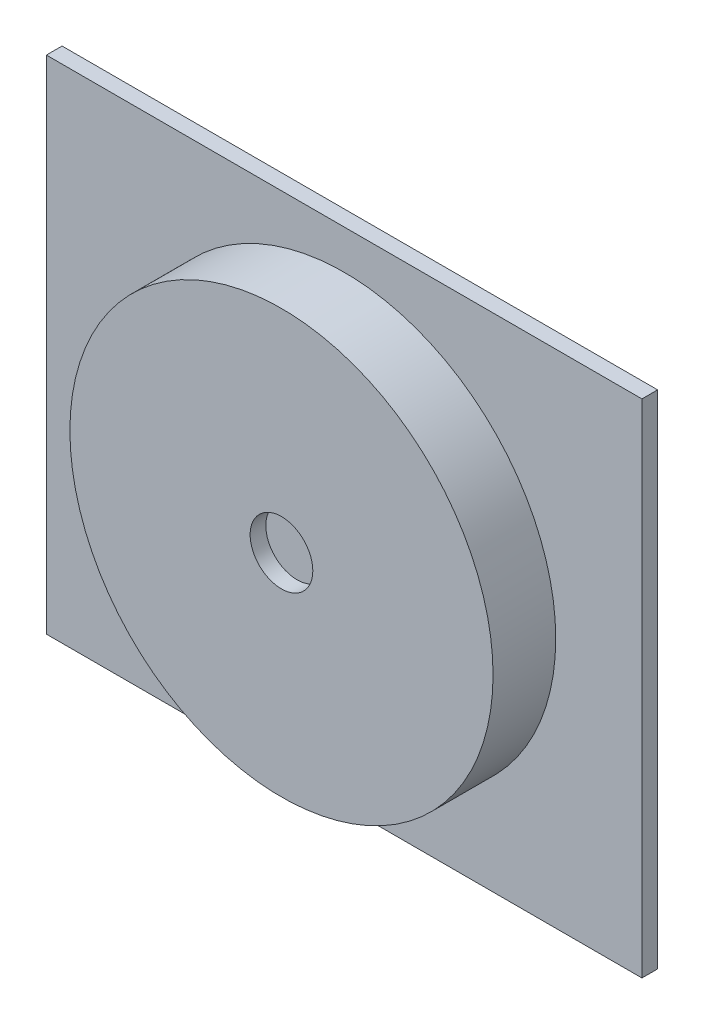
ISO-10303-21;
HEADER;
FILE_DESCRIPTION(('STEP AP214'),'2;1');
FILE_NAME('part.step','',(''),(''),'','','');
FILE_SCHEMA(('AUTOMOTIVE_DESIGN { 1 0 10303 214 1 1 1 1 }'));
ENDSEC;
DATA;
#1=APPLICATION_CONTEXT('core data for automotive mechanical design processes');
#2=APPLICATION_PROTOCOL_DEFINITION('international standard','automotive_design',2000,#1);
#3=PRODUCT_CONTEXT('',#1,'mechanical');
#4=PRODUCT('Part','Part','',(#3));
#5=PRODUCT_RELATED_PRODUCT_CATEGORY('part','',(#4));
#6=PRODUCT_DEFINITION_FORMATION('','',#4);
#7=PRODUCT_DEFINITION_CONTEXT('part definition',#1,'design');
#8=PRODUCT_DEFINITION('design','',#6,#7);
#9=PRODUCT_DEFINITION_SHAPE('','',#8);
#10=(LENGTH_UNIT() NAMED_UNIT(*) SI_UNIT(.MILLI.,.METRE.));
#11=(NAMED_UNIT(*) PLANE_ANGLE_UNIT() SI_UNIT($,.RADIAN.));
#12=(NAMED_UNIT(*) SI_UNIT($,.STERADIAN.) SOLID_ANGLE_UNIT());
#13=UNCERTAINTY_MEASURE_WITH_UNIT(LENGTH_MEASURE(1.E-05),#10,'distance_accuracy_value','');
#14=(GEOMETRIC_REPRESENTATION_CONTEXT(3) GLOBAL_UNCERTAINTY_ASSIGNED_CONTEXT((#13)) GLOBAL_UNIT_ASSIGNED_CONTEXT((#10,
#11,#12)) REPRESENTATION_CONTEXT('',''));
#15=CARTESIAN_POINT('',(0.,0.,0.));
#16=DIRECTION('',(0.,0.,1.));
#17=DIRECTION('',(1.,0.,0.));
#18=AXIS2_PLACEMENT_3D('',#15,#16,#17);
#19=CARTESIAN_POINT('',(-22.0558035714286,11.8973214285714,1.));
#20=DIRECTION('',(1.,0.,0.));
#21=DIRECTION('',(0.,0.,-1.));
#22=AXIS2_PLACEMENT_3D('',#19,#20,#21);
#23=PLANE('',#22);
#24=DIRECTION('',(0.,-1.,0.));
#25=VECTOR('',#24,1.);
#26=CARTESIAN_POINT('',(-22.0558035714286,11.8973214285714,0.));
#27=LINE('',#26,#25);
#28=CARTESIAN_POINT('',(-22.0558035714286,11.8973214285714,0.));
#29=VERTEX_POINT('',#28);
#30=CARTESIAN_POINT('',(-22.0558035714286,-20.1026785714286,0.));
#31=VERTEX_POINT('',#30);
#32=EDGE_CURVE('E98',#29,#31,#27,.T.);
#33=ORIENTED_EDGE('',*,*,#32,.T.);
#34=DIRECTION('',(0.,0.,-1.));
#35=VECTOR('',#34,1.);
#36=CARTESIAN_POINT('',(-22.0558035714286,-20.1026785714286,1.));
#37=LINE('',#36,#35);
#38=CARTESIAN_POINT('',(-22.0558035714286,-20.1026785714286,1.));
#39=VERTEX_POINT('',#38);
#40=EDGE_CURVE('E35',#39,#31,#37,.T.);
#41=ORIENTED_EDGE('',*,*,#40,.F.);
#42=DIRECTION('',(0.,-1.,0.));
#43=VECTOR('',#42,1.);
#44=CARTESIAN_POINT('',(-22.0558035714286,11.8973214285714,1.));
#45=LINE('',#44,#43);
#46=CARTESIAN_POINT('',(-22.0558035714286,11.8973214285714,1.));
#47=VERTEX_POINT('',#46);
#48=EDGE_CURVE('E85',#47,#39,#45,.T.);
#49=ORIENTED_EDGE('',*,*,#48,.F.);
#50=DIRECTION('',(0.,0.,-1.));
#51=VECTOR('',#50,1.);
#52=CARTESIAN_POINT('',(-22.0558035714286,11.8973214285714,1.));
#53=LINE('',#52,#51);
#54=EDGE_CURVE('E94',#47,#29,#53,.T.);
#55=ORIENTED_EDGE('',*,*,#54,.T.);
#56=EDGE_LOOP('',(#33,#41,#49,#55));
#57=FACE_BOUND('',#56,.T.);
#58=ADVANCED_FACE('F32',(#57),#23,.F.);
#59=CARTESIAN_POINT('',(-22.0558035714286,-20.1026785714286,1.));
#60=DIRECTION('',(0.,1.,0.));
#61=DIRECTION('',(0.,0.,1.));
#62=AXIS2_PLACEMENT_3D('',#59,#60,#61);
#63=PLANE('',#62);
#64=DIRECTION('',(1.,0.,0.));
#65=VECTOR('',#64,1.);
#66=CARTESIAN_POINT('',(-22.0558035714286,-20.1026785714286,0.));
#67=LINE('',#66,#65);
#68=CARTESIAN_POINT('',(15.9441964285714,-20.1026785714286,0.));
#69=VERTEX_POINT('',#68);
#70=EDGE_CURVE('E90',#31,#69,#67,.T.);
#71=ORIENTED_EDGE('',*,*,#70,.T.);
#72=DIRECTION('',(0.,0.,-1.));
#73=VECTOR('',#72,1.);
#74=CARTESIAN_POINT('',(15.9441964285714,-20.1026785714286,1.));
#75=LINE('',#74,#73);
#76=CARTESIAN_POINT('',(15.9441964285714,-20.1026785714286,1.));
#77=VERTEX_POINT('',#76);
#78=EDGE_CURVE('E88',#77,#69,#75,.T.);
#79=ORIENTED_EDGE('',*,*,#78,.F.);
#80=DIRECTION('',(1.,0.,0.));
#81=VECTOR('',#80,1.);
#82=CARTESIAN_POINT('',(-22.0558035714286,-20.1026785714286,1.));
#83=LINE('',#82,#81);
#84=EDGE_CURVE('E80',#39,#77,#83,.T.);
#85=ORIENTED_EDGE('',*,*,#84,.F.);
#86=ORIENTED_EDGE('',*,*,#40,.T.);
#87=EDGE_LOOP('',(#71,#79,#85,#86));
#88=FACE_BOUND('',#87,.T.);
#89=ADVANCED_FACE('F89',(#88),#63,.F.);
#90=CARTESIAN_POINT('',(15.9441964285714,11.8973214285714,1.));
#91=DIRECTION('',(-1.,0.,0.));
#92=DIRECTION('',(0.,-1.,0.));
#93=AXIS2_PLACEMENT_3D('',#90,#91,#92);
#94=PLANE('',#93);
#95=DIRECTION('',(0.,1.,0.));
#96=VECTOR('',#95,1.);
#97=CARTESIAN_POINT('',(15.9441964285714,11.8973214285714,0.));
#98=LINE('',#97,#96);
#99=CARTESIAN_POINT('',(15.9441964285714,11.8973214285714,0.));
#100=VERTEX_POINT('',#99);
#101=EDGE_CURVE('E66',#69,#100,#98,.T.);
#102=ORIENTED_EDGE('',*,*,#101,.T.);
#103=DIRECTION('',(0.,0.,-1.));
#104=VECTOR('',#103,1.);
#105=CARTESIAN_POINT('',(15.9441964285714,11.8973214285714,1.));
#106=LINE('',#105,#104);
#107=CARTESIAN_POINT('',(15.9441964285714,11.8973214285714,1.));
#108=VERTEX_POINT('',#107);
#109=EDGE_CURVE('E91',#108,#100,#106,.T.);
#110=ORIENTED_EDGE('',*,*,#109,.F.);
#111=DIRECTION('',(0.,1.,0.));
#112=VECTOR('',#111,1.);
#113=CARTESIAN_POINT('',(15.9441964285714,11.8973214285714,1.));
#114=LINE('',#113,#112);
#115=EDGE_CURVE('E83',#77,#108,#114,.T.);
#116=ORIENTED_EDGE('',*,*,#115,.F.);
#117=ORIENTED_EDGE('',*,*,#78,.T.);
#118=EDGE_LOOP('',(#102,#110,#116,#117));
#119=FACE_BOUND('',#118,.T.);
#120=ADVANCED_FACE('F92',(#119),#94,.F.);
#121=CARTESIAN_POINT('',(-22.0558035714286,11.8973214285714,1.));
#122=DIRECTION('',(0.,-1.,0.));
#123=DIRECTION('',(0.,0.,-1.));
#124=AXIS2_PLACEMENT_3D('',#121,#122,#123);
#125=PLANE('',#124);
#126=DIRECTION('',(-1.,0.,0.));
#127=VECTOR('',#126,1.);
#128=CARTESIAN_POINT('',(-22.0558035714286,11.8973214285714,0.));
#129=LINE('',#128,#127);
#130=EDGE_CURVE('E72',#100,#29,#129,.T.);
#131=ORIENTED_EDGE('',*,*,#130,.T.);
#132=ORIENTED_EDGE('',*,*,#54,.F.);
#133=DIRECTION('',(-1.,0.,0.));
#134=VECTOR('',#133,1.);
#135=CARTESIAN_POINT('',(-22.0558035714286,11.8973214285714,1.));
#136=LINE('',#135,#134);
#137=EDGE_CURVE('E49',#108,#47,#136,.T.);
#138=ORIENTED_EDGE('',*,*,#137,.F.);
#139=ORIENTED_EDGE('',*,*,#109,.T.);
#140=EDGE_LOOP('',(#131,#132,#138,#139));
#141=FACE_BOUND('',#140,.T.);
#142=ADVANCED_FACE('F106',(#141),#125,.F.);
#143=CARTESIAN_POINT('',(0.,0.,1.));
#144=DIRECTION('',(0.,0.,1.));
#145=DIRECTION('',(1.,0.,0.));
#146=AXIS2_PLACEMENT_3D('',#143,#144,#145);
#147=PLANE('',#146);
#148=CARTESIAN_POINT('',(-3.05580357142858,-4.10267857142857,1.));
#149=DIRECTION('',(0.,0.,1.));
#150=DIRECTION('',(1.,0.,0.));
#151=AXIS2_PLACEMENT_3D('',#148,#149,#150);
#152=CIRCLE('',#151,13.5);
#153=CARTESIAN_POINT('',(10.4441964285714,-4.10267857142857,1.));
#154=VERTEX_POINT('',#153);
#155=EDGE_CURVE('E11',#154,#154,#152,.T.);
#156=ORIENTED_EDGE('',*,*,#155,.F.);
#157=EDGE_LOOP('',(#156));
#158=FACE_BOUND('',#157,.T.);
#159=ORIENTED_EDGE('',*,*,#48,.T.);
#160=ORIENTED_EDGE('',*,*,#84,.T.);
#161=ORIENTED_EDGE('',*,*,#115,.T.);
#162=ORIENTED_EDGE('',*,*,#137,.T.);
#163=EDGE_LOOP('',(#159,#160,#161,#162));
#164=FACE_BOUND('',#163,.T.);
#165=ADVANCED_FACE('F81',(#158,#164),#147,.T.);
#166=CARTESIAN_POINT('',(0.,0.,0.));
#167=DIRECTION('',(0.,0.,1.));
#168=DIRECTION('',(1.,0.,0.));
#169=AXIS2_PLACEMENT_3D('',#166,#167,#168);
#170=PLANE('',#169);
#171=ORIENTED_EDGE('',*,*,#32,.F.);
#172=ORIENTED_EDGE('',*,*,#130,.F.);
#173=ORIENTED_EDGE('',*,*,#101,.F.);
#174=ORIENTED_EDGE('',*,*,#70,.F.);
#175=EDGE_LOOP('',(#171,#172,#173,#174));
#176=FACE_BOUND('',#175,.T.);
#177=ADVANCED_FACE('F109',(#176),#170,.F.);
#178=CARTESIAN_POINT('',(-3.05580357142858,-4.10267857142857,5.));
#179=DIRECTION('',(0.,0.,-1.));
#180=DIRECTION('',(-1.,0.,0.));
#181=AXIS2_PLACEMENT_3D('',#178,#179,#180);
#182=CYLINDRICAL_SURFACE('',#181,13.5);
#183=CARTESIAN_POINT('',(-3.05580357142858,-4.10267857142857,5.));
#184=DIRECTION('',(0.,0.,1.));
#185=DIRECTION('',(1.,0.,0.));
#186=AXIS2_PLACEMENT_3D('',#183,#184,#185);
#187=CIRCLE('',#186,13.5);
#188=CARTESIAN_POINT('',(10.4441964285714,-4.10267857142857,5.));
#189=VERTEX_POINT('',#188);
#190=EDGE_CURVE('E101',#189,#189,#187,.T.);
#191=ORIENTED_EDGE('',*,*,#190,.F.);
#192=EDGE_LOOP('',(#191));
#193=FACE_BOUND('',#192,.T.);
#194=ORIENTED_EDGE('',*,*,#155,.T.);
#195=EDGE_LOOP('',(#194));
#196=FACE_BOUND('',#195,.T.);
#197=ADVANCED_FACE('F132',(#193,#196),#182,.T.);
#198=CARTESIAN_POINT('',(-3.05580357142858,-4.10267857142857,5.));
#199=DIRECTION('',(0.,0.,1.));
#200=DIRECTION('',(1.,0.,0.));
#201=AXIS2_PLACEMENT_3D('',#198,#199,#200);
#202=PLANE('',#201);
#203=CARTESIAN_POINT('',(-3.05580357142858,-4.10267857142857,5.));
#204=DIRECTION('',(0.,0.,1.));
#205=DIRECTION('',(1.,0.,0.));
#206=AXIS2_PLACEMENT_3D('',#203,#204,#205);
#207=CIRCLE('',#206,2.);
#208=CARTESIAN_POINT('',(-1.05580357142858,-4.10267857142857,5.));
#209=VERTEX_POINT('',#208);
#210=EDGE_CURVE('E115',#209,#209,#207,.T.);
#211=ORIENTED_EDGE('',*,*,#210,.F.);
#212=EDGE_LOOP('',(#211));
#213=FACE_BOUND('',#212,.T.);
#214=ORIENTED_EDGE('',*,*,#190,.T.);
#215=EDGE_LOOP('',(#214));
#216=FACE_BOUND('',#215,.T.);
#217=ADVANCED_FACE('F126',(#213,#216),#202,.T.);
#218=CARTESIAN_POINT('',(-3.05580357142858,-4.10267857142857,4.));
#219=DIRECTION('',(0.,0.,1.));
#220=DIRECTION('',(1.,0.,0.));
#221=AXIS2_PLACEMENT_3D('',#218,#219,#220);
#222=CYLINDRICAL_SURFACE('',#221,2.);
#223=CARTESIAN_POINT('',(-3.05580357142858,-4.10267857142857,4.));
#224=DIRECTION('',(0.,0.,1.));
#225=DIRECTION('',(1.,0.,0.));
#226=AXIS2_PLACEMENT_3D('',#223,#224,#225);
#227=CIRCLE('',#226,2.);
#228=CARTESIAN_POINT('',(-1.05580357142858,-4.10267857142857,4.));
#229=VERTEX_POINT('',#228);
#230=EDGE_CURVE('E114',#229,#229,#227,.T.);
#231=ORIENTED_EDGE('',*,*,#230,.F.);
#232=EDGE_LOOP('',(#231));
#233=FACE_BOUND('',#232,.T.);
#234=ORIENTED_EDGE('',*,*,#210,.T.);
#235=EDGE_LOOP('',(#234));
#236=FACE_BOUND('',#235,.T.);
#237=ADVANCED_FACE('F123',(#233,#236),#222,.F.);
#238=CARTESIAN_POINT('',(-3.05580357142858,-4.10267857142857,4.));
#239=DIRECTION('',(0.,0.,1.));
#240=DIRECTION('',(1.,0.,0.));
#241=AXIS2_PLACEMENT_3D('',#238,#239,#240);
#242=PLANE('',#241);
#243=ORIENTED_EDGE('',*,*,#230,.T.);
#244=EDGE_LOOP('',(#243));
#245=FACE_BOUND('',#244,.T.);
#246=ADVANCED_FACE('F121',(#245),#242,.T.);
#247=CLOSED_SHELL('',(#58,#89,#120,#142,#165,#177,#197,#217,#237,#246));
#248=MANIFOLD_SOLID_BREP('B2',#247);
#249=ADVANCED_BREP_SHAPE_REPRESENTATION('',(#18,#248),#14);
#250=SHAPE_DEFINITION_REPRESENTATION(#9,#249);
ENDSEC;
END-ISO-10303-21;
